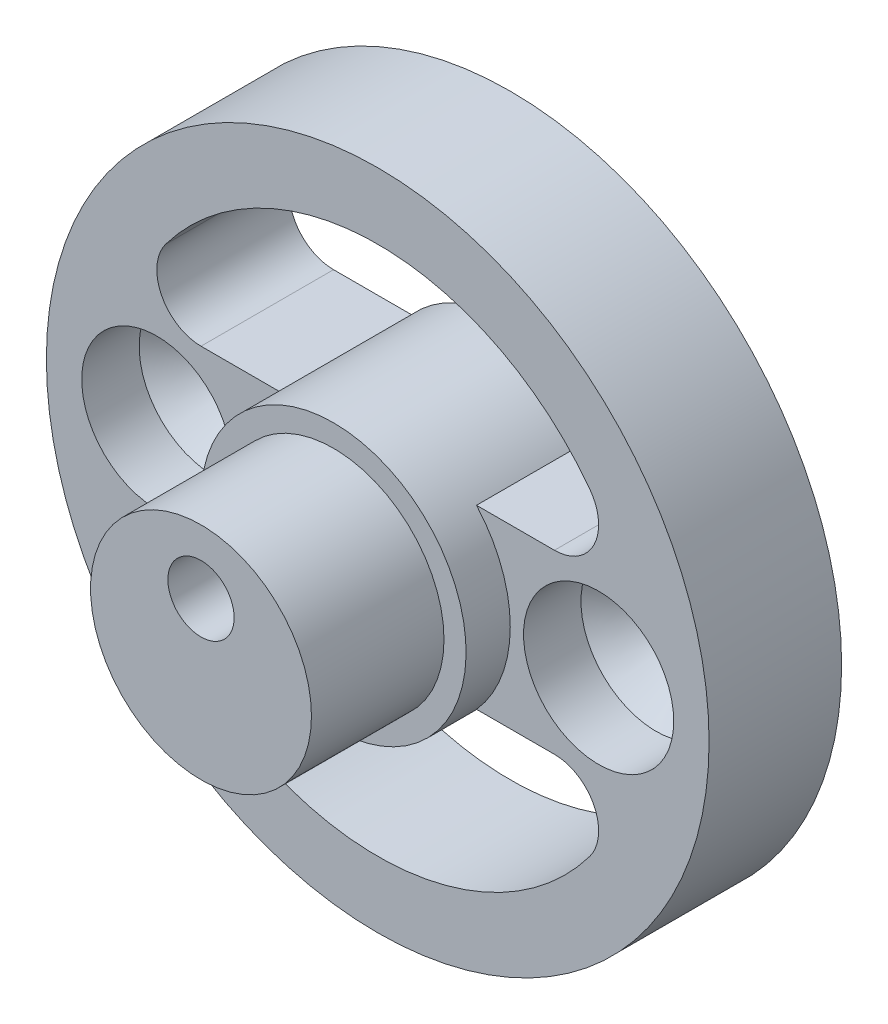
ISO-10303-21;
HEADER;
FILE_DESCRIPTION(('STEP AP214'),'2;1');
FILE_NAME('part.step','',(''),(''),'','','');
FILE_SCHEMA(('AUTOMOTIVE_DESIGN { 1 0 10303 214 1 1 1 1 }'));
ENDSEC;
DATA;
#1=APPLICATION_CONTEXT('core data for automotive mechanical design processes');
#2=APPLICATION_PROTOCOL_DEFINITION('international standard','automotive_design',2000,#1);
#3=PRODUCT_CONTEXT('',#1,'mechanical');
#4=PRODUCT('Part','Part','',(#3));
#5=PRODUCT_RELATED_PRODUCT_CATEGORY('part','',(#4));
#6=PRODUCT_DEFINITION_FORMATION('','',#4);
#7=PRODUCT_DEFINITION_CONTEXT('part definition',#1,'design');
#8=PRODUCT_DEFINITION('design','',#6,#7);
#9=PRODUCT_DEFINITION_SHAPE('','',#8);
#10=(LENGTH_UNIT() NAMED_UNIT(*) SI_UNIT(.MILLI.,.METRE.));
#11=(NAMED_UNIT(*) PLANE_ANGLE_UNIT() SI_UNIT($,.RADIAN.));
#12=(NAMED_UNIT(*) SI_UNIT($,.STERADIAN.) SOLID_ANGLE_UNIT());
#13=UNCERTAINTY_MEASURE_WITH_UNIT(LENGTH_MEASURE(1.E-05),#10,'distance_accuracy_value','');
#14=(GEOMETRIC_REPRESENTATION_CONTEXT(3) GLOBAL_UNCERTAINTY_ASSIGNED_CONTEXT((#13)) GLOBAL_UNIT_ASSIGNED_CONTEXT((#10,
#11,#12)) REPRESENTATION_CONTEXT('',''));
#15=CARTESIAN_POINT('',(0.,0.,0.));
#16=DIRECTION('',(0.,0.,1.));
#17=DIRECTION('',(1.,0.,0.));
#18=AXIS2_PLACEMENT_3D('',#15,#16,#17);
#19=CARTESIAN_POINT('',(5.,0.,-4.));
#20=DIRECTION('',(0.,0.,1.));
#21=DIRECTION('',(1.,0.,0.));
#22=AXIS2_PLACEMENT_3D('',#19,#20,#21);
#23=CYLINDRICAL_SURFACE('',#22,1.);
#24=CARTESIAN_POINT('',(5.,0.,-4.));
#25=DIRECTION('',(0.,0.,-1.));
#26=DIRECTION('',(-1.,0.,0.));
#27=AXIS2_PLACEMENT_3D('',#24,#25,#26);
#28=CIRCLE('',#27,1.);
#29=CARTESIAN_POINT('',(4.,0.,-4.));
#30=VERTEX_POINT('',#29);
#31=EDGE_CURVE('E179',#30,#30,#28,.T.);
#32=ORIENTED_EDGE('',*,*,#31,.T.);
#33=EDGE_LOOP('',(#32));
#34=FACE_BOUND('',#33,.T.);
#35=CARTESIAN_POINT('',(5.,0.,-3.));
#36=DIRECTION('',(0.,0.,1.));
#37=DIRECTION('',(1.,0.,0.));
#38=AXIS2_PLACEMENT_3D('',#35,#36,#37);
#39=CIRCLE('',#38,0.999999999999999);
#40=CARTESIAN_POINT('',(6.,0.,-3.));
#41=VERTEX_POINT('',#40);
#42=EDGE_CURVE('E267',#41,#41,#39,.F.);
#43=ORIENTED_EDGE('',*,*,#42,.F.);
#44=EDGE_LOOP('',(#43));
#45=FACE_BOUND('',#44,.T.);
#46=ADVANCED_FACE('F43',(#34,#45),#23,.F.);
#47=CARTESIAN_POINT('',(-5.,0.,-4.));
#48=DIRECTION('',(0.,0.,1.));
#49=DIRECTION('',(1.,0.,0.));
#50=AXIS2_PLACEMENT_3D('',#47,#48,#49);
#51=CYLINDRICAL_SURFACE('',#50,1.);
#52=CARTESIAN_POINT('',(-5.,0.,-4.));
#53=DIRECTION('',(0.,0.,-1.));
#54=DIRECTION('',(-1.,0.,0.));
#55=AXIS2_PLACEMENT_3D('',#52,#53,#54);
#56=CIRCLE('',#55,1.);
#57=CARTESIAN_POINT('',(-6.,0.,-4.));
#58=VERTEX_POINT('',#57);
#59=EDGE_CURVE('E160',#58,#58,#56,.T.);
#60=ORIENTED_EDGE('',*,*,#59,.T.);
#61=EDGE_LOOP('',(#60));
#62=FACE_BOUND('',#61,.T.);
#63=CARTESIAN_POINT('',(-5.,0.,-3.));
#64=DIRECTION('',(0.,0.,1.));
#65=DIRECTION('',(1.,0.,0.));
#66=AXIS2_PLACEMENT_3D('',#63,#64,#65);
#67=CIRCLE('',#66,0.999999999999997);
#68=CARTESIAN_POINT('',(-4.,0.,-3.));
#69=VERTEX_POINT('',#68);
#70=EDGE_CURVE('E262',#69,#69,#67,.F.);
#71=ORIENTED_EDGE('',*,*,#70,.F.);
#72=EDGE_LOOP('',(#71));
#73=FACE_BOUND('',#72,.T.);
#74=ADVANCED_FACE('F291',(#62,#73),#51,.F.);
#75=CARTESIAN_POINT('',(0.,0.,3.));
#76=DIRECTION('',(0.,0.,1.));
#77=DIRECTION('',(1.,0.,0.));
#78=AXIS2_PLACEMENT_3D('',#75,#76,#77);
#79=PLANE('',#78);
#80=CARTESIAN_POINT('',(0.,1.051,3.));
#81=DIRECTION('',(0.,0.,1.));
#82=DIRECTION('',(1.,0.,0.));
#83=AXIS2_PLACEMENT_3D('',#80,#81,#82);
#84=CIRCLE('',#83,0.75);
#85=CARTESIAN_POINT('',(0.75,1.051,3.));
#86=VERTEX_POINT('',#85);
#87=EDGE_CURVE('E216',#86,#86,#84,.T.);
#88=ORIENTED_EDGE('',*,*,#87,.F.);
#89=EDGE_LOOP('',(#88));
#90=FACE_BOUND('',#89,.T.);
#91=CARTESIAN_POINT('',(0.,0.,3.));
#92=DIRECTION('',(0.,0.,1.));
#93=DIRECTION('',(1.,0.,0.));
#94=AXIS2_PLACEMENT_3D('',#91,#92,#93);
#95=CIRCLE('',#94,2.5);
#96=CARTESIAN_POINT('',(2.5,0.,3.));
#97=VERTEX_POINT('',#96);
#98=EDGE_CURVE('E214',#97,#97,#95,.T.);
#99=ORIENTED_EDGE('',*,*,#98,.T.);
#100=EDGE_LOOP('',(#99));
#101=FACE_BOUND('',#100,.T.);
#102=ADVANCED_FACE('F294',(#90,#101),#79,.T.);
#103=CARTESIAN_POINT('',(0.,1.051,3.));
#104=DIRECTION('',(0.,0.,-1.));
#105=DIRECTION('',(-1.,0.,0.));
#106=AXIS2_PLACEMENT_3D('',#103,#104,#105);
#107=CYLINDRICAL_SURFACE('',#106,0.75);
#108=ORIENTED_EDGE('',*,*,#87,.T.);
#109=EDGE_LOOP('',(#108));
#110=FACE_BOUND('',#109,.T.);
#111=CARTESIAN_POINT('',(0.,1.051,-4.));
#112=DIRECTION('',(0.,0.,-1.));
#113=DIRECTION('',(-1.,0.,0.));
#114=AXIS2_PLACEMENT_3D('',#111,#112,#113);
#115=CIRCLE('',#114,0.75);
#116=CARTESIAN_POINT('',(-0.75,1.051,-4.));
#117=VERTEX_POINT('',#116);
#118=EDGE_CURVE('E173',#117,#117,#115,.T.);
#119=ORIENTED_EDGE('',*,*,#118,.T.);
#120=EDGE_LOOP('',(#119));
#121=FACE_BOUND('',#120,.T.);
#122=ADVANCED_FACE('F279',(#110,#121),#107,.F.);
#123=CARTESIAN_POINT('',(0.,0.,-7.));
#124=DIRECTION('',(0.,0.,1.));
#125=DIRECTION('',(1.,0.,0.));
#126=AXIS2_PLACEMENT_3D('',#123,#124,#125);
#127=CYLINDRICAL_SURFACE('',#126,2.5);
#128=ORIENTED_EDGE('',*,*,#98,.F.);
#129=EDGE_LOOP('',(#128));
#130=FACE_BOUND('',#129,.T.);
#131=CARTESIAN_POINT('',(0.,0.,0.));
#132=DIRECTION('',(0.,0.,1.));
#133=DIRECTION('',(1.,0.,0.));
#134=AXIS2_PLACEMENT_3D('',#131,#132,#133);
#135=CIRCLE('',#134,2.5);
#136=CARTESIAN_POINT('',(2.5,0.,0.));
#137=VERTEX_POINT('',#136);
#138=EDGE_CURVE('E220',#137,#137,#135,.T.);
#139=ORIENTED_EDGE('',*,*,#138,.T.);
#140=EDGE_LOOP('',(#139));
#141=FACE_BOUND('',#140,.T.);
#142=ADVANCED_FACE('F321',(#130,#141),#127,.T.);
#143=CARTESIAN_POINT('',(0.,0.,0.));
#144=DIRECTION('',(0.,0.,-1.));
#145=DIRECTION('',(-1.,0.,0.));
#146=AXIS2_PLACEMENT_3D('',#143,#144,#145);
#147=PLANE('',#146);
#148=ORIENTED_EDGE('',*,*,#138,.F.);
#149=EDGE_LOOP('',(#148));
#150=FACE_BOUND('',#149,.T.);
#151=CARTESIAN_POINT('',(0.,0.,0.));
#152=DIRECTION('',(0.,0.,-1.));
#153=DIRECTION('',(-1.,0.,0.));
#154=AXIS2_PLACEMENT_3D('',#151,#152,#153);
#155=CIRCLE('',#154,3.);
#156=CARTESIAN_POINT('',(-3.,0.,0.));
#157=VERTEX_POINT('',#156);
#158=EDGE_CURVE('E210',#157,#157,#155,.T.);
#159=ORIENTED_EDGE('',*,*,#158,.F.);
#160=EDGE_LOOP('',(#159));
#161=FACE_BOUND('',#160,.T.);
#162=ADVANCED_FACE('F322',(#150,#161),#147,.F.);
#163=CARTESIAN_POINT('',(0.,0.,-1.));
#164=DIRECTION('',(0.,0.,1.));
#165=DIRECTION('',(1.,0.,0.));
#166=AXIS2_PLACEMENT_3D('',#163,#164,#165);
#167=CYLINDRICAL_SURFACE('',#166,3.);
#168=CARTESIAN_POINT('',(0.,0.,-1.));
#169=DIRECTION('',(0.,0.,-1.));
#170=DIRECTION('',(-1.,0.,0.));
#171=AXIS2_PLACEMENT_3D('',#168,#169,#170);
#172=CIRCLE('',#171,3.);
#173=CARTESIAN_POINT('',(2.23606797749979,2.,-1.));
#174=VERTEX_POINT('',#173);
#175=CARTESIAN_POINT('',(2.23606797749979,-2.,-1.));
#176=VERTEX_POINT('',#175);
#177=EDGE_CURVE('E208',#174,#176,#172,.T.);
#178=ORIENTED_EDGE('',*,*,#177,.F.);
#179=DIRECTION('',(0.,0.,1.));
#180=VECTOR('',#179,1.);
#181=CARTESIAN_POINT('',(2.23606797749979,2.,-4.));
#182=LINE('',#181,#180);
#183=CARTESIAN_POINT('',(2.23606797749979,2.,-4.));
#184=VERTEX_POINT('',#183);
#185=EDGE_CURVE('E145',#184,#174,#182,.T.);
#186=ORIENTED_EDGE('',*,*,#185,.F.);
#187=CARTESIAN_POINT('',(0.,0.,-4.));
#188=DIRECTION('',(0.,0.,1.));
#189=DIRECTION('',(-1.,0.,0.));
#190=AXIS2_PLACEMENT_3D('',#187,#188,#189);
#191=CIRCLE('',#190,3.);
#192=CARTESIAN_POINT('',(-2.23606797749979,2.,-4.));
#193=VERTEX_POINT('',#192);
#194=EDGE_CURVE('E132',#184,#193,#191,.T.);
#195=ORIENTED_EDGE('',*,*,#194,.T.);
#196=DIRECTION('',(0.,0.,1.));
#197=VECTOR('',#196,1.);
#198=CARTESIAN_POINT('',(-2.23606797749979,2.,-4.));
#199=LINE('',#198,#197);
#200=CARTESIAN_POINT('',(-2.23606797749979,2.,-1.));
#201=VERTEX_POINT('',#200);
#202=EDGE_CURVE('E138',#193,#201,#199,.T.);
#203=ORIENTED_EDGE('',*,*,#202,.T.);
#204=CARTESIAN_POINT('',(-2.23606797749979,-2.,-1.));
#205=VERTEX_POINT('',#204);
#206=EDGE_CURVE('E206',#205,#201,#172,.T.);
#207=ORIENTED_EDGE('',*,*,#206,.F.);
#208=DIRECTION('',(0.,0.,1.));
#209=VECTOR('',#208,1.);
#210=CARTESIAN_POINT('',(-2.23606797749979,-2.,-4.));
#211=LINE('',#210,#209);
#212=CARTESIAN_POINT('',(-2.23606797749979,-2.,-4.));
#213=VERTEX_POINT('',#212);
#214=EDGE_CURVE('E201',#213,#205,#211,.T.);
#215=ORIENTED_EDGE('',*,*,#214,.F.);
#216=CARTESIAN_POINT('',(0.,0.,-4.));
#217=DIRECTION('',(0.,0.,1.));
#218=DIRECTION('',(-1.,0.,0.));
#219=AXIS2_PLACEMENT_3D('',#216,#217,#218);
#220=CIRCLE('',#219,3.);
#221=CARTESIAN_POINT('',(2.23606797749979,-2.,-4.));
#222=VERTEX_POINT('',#221);
#223=EDGE_CURVE('E188',#213,#222,#220,.T.);
#224=ORIENTED_EDGE('',*,*,#223,.T.);
#225=DIRECTION('',(0.,0.,1.));
#226=VECTOR('',#225,1.);
#227=CARTESIAN_POINT('',(2.23606797749979,-2.,-4.));
#228=LINE('',#227,#226);
#229=EDGE_CURVE('E196',#222,#176,#228,.T.);
#230=ORIENTED_EDGE('',*,*,#229,.T.);
#231=EDGE_LOOP('',(#178,#186,#195,#203,#207,#215,#224,#230));
#232=FACE_BOUND('',#231,.T.);
#233=ORIENTED_EDGE('',*,*,#158,.T.);
#234=EDGE_LOOP('',(#233));
#235=FACE_BOUND('',#234,.T.);
#236=ADVANCED_FACE('F140',(#232,#235),#167,.T.);
#237=CARTESIAN_POINT('',(0.,0.,-1.));
#238=DIRECTION('',(0.,0.,-1.));
#239=DIRECTION('',(-1.,0.,0.));
#240=AXIS2_PLACEMENT_3D('',#237,#238,#239);
#241=PLANE('',#240);
#242=CARTESIAN_POINT('',(-5.,0.,-1.));
#243=DIRECTION('',(0.,0.,1.));
#244=DIRECTION('',(1.,0.,0.));
#245=AXIS2_PLACEMENT_3D('',#242,#243,#244);
#246=CIRCLE('',#245,1.7);
#247=CARTESIAN_POINT('',(-3.3,0.,-1.));
#248=VERTEX_POINT('',#247);
#249=EDGE_CURVE('E270',#248,#248,#246,.T.);
#250=ORIENTED_EDGE('',*,*,#249,.F.);
#251=EDGE_LOOP('',(#250));
#252=FACE_BOUND('',#251,.T.);
#253=CARTESIAN_POINT('',(5.,0.,-1.));
#254=DIRECTION('',(0.,0.,1.));
#255=DIRECTION('',(1.,0.,0.));
#256=AXIS2_PLACEMENT_3D('',#253,#254,#255);
#257=CIRCLE('',#256,1.7);
#258=CARTESIAN_POINT('',(6.7,0.,-1.));
#259=VERTEX_POINT('',#258);
#260=EDGE_CURVE('E275',#259,#259,#257,.T.);
#261=ORIENTED_EDGE('',*,*,#260,.F.);
#262=EDGE_LOOP('',(#261));
#263=FACE_BOUND('',#262,.T.);
#264=CARTESIAN_POINT('',(0.,0.,-1.));
#265=DIRECTION('',(0.,0.,1.));
#266=DIRECTION('',(1.,0.,0.));
#267=AXIS2_PLACEMENT_3D('',#264,#265,#266);
#268=CIRCLE('',#267,7.5);
#269=CARTESIAN_POINT('',(7.5,0.,-1.));
#270=VERTEX_POINT('',#269);
#271=EDGE_CURVE('E398',#270,#270,#268,.T.);
#272=ORIENTED_EDGE('',*,*,#271,.T.);
#273=EDGE_LOOP('',(#272));
#274=FACE_BOUND('',#273,.T.);
#275=CARTESIAN_POINT('',(0.,0.,-1.));
#276=DIRECTION('',(0.,0.,-1.));
#277=DIRECTION('',(-1.,0.,0.));
#278=AXIS2_PLACEMENT_3D('',#275,#276,#277);
#279=CIRCLE('',#278,6.);
#280=CARTESIAN_POINT('',(-4.8,3.6,-1.));
#281=VERTEX_POINT('',#280);
#282=CARTESIAN_POINT('',(4.8,3.6,-1.));
#283=VERTEX_POINT('',#282);
#284=EDGE_CURVE('E175',#281,#283,#279,.T.);
#285=ORIENTED_EDGE('',*,*,#284,.T.);
#286=CARTESIAN_POINT('',(4.,3.,-1.));
#287=DIRECTION('',(0.,0.,-1.));
#288=DIRECTION('',(-1.,0.,0.));
#289=AXIS2_PLACEMENT_3D('',#286,#287,#288);
#290=CIRCLE('',#289,1.);
#291=CARTESIAN_POINT('',(4.,2.,-1.));
#292=VERTEX_POINT('',#291);
#293=EDGE_CURVE('E242',#283,#292,#290,.T.);
#294=ORIENTED_EDGE('',*,*,#293,.T.);
#295=DIRECTION('',(-1.,0.,0.));
#296=VECTOR('',#295,1.);
#297=CARTESIAN_POINT('',(2.23606797749979,2.,-1.));
#298=LINE('',#297,#296);
#299=EDGE_CURVE('E150',#292,#174,#298,.T.);
#300=ORIENTED_EDGE('',*,*,#299,.T.);
#301=ORIENTED_EDGE('',*,*,#177,.T.);
#302=DIRECTION('',(1.,0.,0.));
#303=VECTOR('',#302,1.);
#304=CARTESIAN_POINT('',(2.23606797749979,-2.,-1.));
#305=LINE('',#304,#303);
#306=CARTESIAN_POINT('',(4.,-2.,-1.));
#307=VERTEX_POINT('',#306);
#308=EDGE_CURVE('E189',#176,#307,#305,.T.);
#309=ORIENTED_EDGE('',*,*,#308,.T.);
#310=CARTESIAN_POINT('',(4.,-3.,-1.));
#311=DIRECTION('',(0.,0.,-1.));
#312=DIRECTION('',(-1.,0.,0.));
#313=AXIS2_PLACEMENT_3D('',#310,#311,#312);
#314=CIRCLE('',#313,1.);
#315=CARTESIAN_POINT('',(4.8,-3.6,-1.));
#316=VERTEX_POINT('',#315);
#317=EDGE_CURVE('E239',#307,#316,#314,.T.);
#318=ORIENTED_EDGE('',*,*,#317,.T.);
#319=CARTESIAN_POINT('',(0.,0.,-1.));
#320=DIRECTION('',(0.,0.,-1.));
#321=DIRECTION('',(-1.,0.,0.));
#322=AXIS2_PLACEMENT_3D('',#319,#320,#321);
#323=CIRCLE('',#322,6.);
#324=CARTESIAN_POINT('',(-4.8,-3.6,-1.));
#325=VERTEX_POINT('',#324);
#326=EDGE_CURVE('E182',#316,#325,#323,.T.);
#327=ORIENTED_EDGE('',*,*,#326,.T.);
#328=CARTESIAN_POINT('',(-4.,-3.,-1.));
#329=DIRECTION('',(0.,0.,-1.));
#330=DIRECTION('',(-1.,0.,0.));
#331=AXIS2_PLACEMENT_3D('',#328,#329,#330);
#332=CIRCLE('',#331,1.);
#333=CARTESIAN_POINT('',(-4.,-2.,-1.));
#334=VERTEX_POINT('',#333);
#335=EDGE_CURVE('E70',#325,#334,#332,.T.);
#336=ORIENTED_EDGE('',*,*,#335,.T.);
#337=DIRECTION('',(1.,0.,0.));
#338=VECTOR('',#337,1.);
#339=CARTESIAN_POINT('',(-2.23606797749979,-2.,-1.));
#340=LINE('',#339,#338);
#341=EDGE_CURVE('E198',#334,#205,#340,.T.);
#342=ORIENTED_EDGE('',*,*,#341,.T.);
#343=ORIENTED_EDGE('',*,*,#206,.T.);
#344=DIRECTION('',(-1.,0.,0.));
#345=VECTOR('',#344,1.);
#346=CARTESIAN_POINT('',(-2.23606797749979,2.,-1.));
#347=LINE('',#346,#345);
#348=CARTESIAN_POINT('',(-4.,2.,-1.));
#349=VERTEX_POINT('',#348);
#350=EDGE_CURVE('E157',#201,#349,#347,.T.);
#351=ORIENTED_EDGE('',*,*,#350,.T.);
#352=CARTESIAN_POINT('',(-4.,3.,-1.));
#353=DIRECTION('',(0.,0.,-1.));
#354=DIRECTION('',(-1.,0.,0.));
#355=AXIS2_PLACEMENT_3D('',#352,#353,#354);
#356=CIRCLE('',#355,1.);
#357=EDGE_CURVE('E247',#349,#281,#356,.T.);
#358=ORIENTED_EDGE('',*,*,#357,.T.);
#359=EDGE_LOOP('',(#285,#294,#300,#301,#309,#318,#327,#336,#342,#343,#351,#358));
#360=FACE_BOUND('',#359,.T.);
#361=ADVANCED_FACE('F283',(#252,#263,#274,#360),#241,.F.);
#362=CARTESIAN_POINT('',(0.,0.,-4.));
#363=DIRECTION('',(0.,0.,-1.));
#364=DIRECTION('',(-1.,0.,0.));
#365=AXIS2_PLACEMENT_3D('',#362,#363,#364);
#366=PLANE('',#365);
#367=CARTESIAN_POINT('',(0.,0.,-4.));
#368=DIRECTION('',(0.,0.,1.));
#369=DIRECTION('',(1.,0.,0.));
#370=AXIS2_PLACEMENT_3D('',#367,#368,#369);
#371=CIRCLE('',#370,7.5);
#372=CARTESIAN_POINT('',(7.5,0.,-4.));
#373=VERTEX_POINT('',#372);
#374=EDGE_CURVE('E400',#373,#373,#371,.T.);
#375=ORIENTED_EDGE('',*,*,#374,.F.);
#376=EDGE_LOOP('',(#375));
#377=FACE_BOUND('',#376,.T.);
#378=ORIENTED_EDGE('',*,*,#118,.F.);
#379=EDGE_LOOP('',(#378));
#380=FACE_BOUND('',#379,.T.);
#381=ORIENTED_EDGE('',*,*,#31,.F.);
#382=EDGE_LOOP('',(#381));
#383=FACE_BOUND('',#382,.T.);
#384=DIRECTION('',(1.,0.,0.));
#385=VECTOR('',#384,1.);
#386=CARTESIAN_POINT('',(-2.23606797749979,-2.,-4.));
#387=LINE('',#386,#385);
#388=CARTESIAN_POINT('',(-4.,-2.,-4.));
#389=VERTEX_POINT('',#388);
#390=EDGE_CURVE('E190',#389,#213,#387,.T.);
#391=ORIENTED_EDGE('',*,*,#390,.F.);
#392=CARTESIAN_POINT('',(-4.,-3.,-4.));
#393=DIRECTION('',(0.,0.,-1.));
#394=DIRECTION('',(-1.,0.,0.));
#395=AXIS2_PLACEMENT_3D('',#392,#393,#394);
#396=CIRCLE('',#395,1.);
#397=CARTESIAN_POINT('',(-4.8,-3.6,-4.));
#398=VERTEX_POINT('',#397);
#399=EDGE_CURVE('E255',#389,#398,#396,.F.);
#400=ORIENTED_EDGE('',*,*,#399,.T.);
#401=CARTESIAN_POINT('',(0.,0.,-4.));
#402=DIRECTION('',(0.,0.,-1.));
#403=DIRECTION('',(-1.,0.,0.));
#404=AXIS2_PLACEMENT_3D('',#401,#402,#403);
#405=CIRCLE('',#404,6.);
#406=CARTESIAN_POINT('',(4.8,-3.6,-4.));
#407=VERTEX_POINT('',#406);
#408=EDGE_CURVE('E183',#407,#398,#405,.T.);
#409=ORIENTED_EDGE('',*,*,#408,.F.);
#410=CARTESIAN_POINT('',(4.,-3.,-4.));
#411=DIRECTION('',(0.,0.,-1.));
#412=DIRECTION('',(-1.,0.,0.));
#413=AXIS2_PLACEMENT_3D('',#410,#411,#412);
#414=CIRCLE('',#413,1.);
#415=CARTESIAN_POINT('',(4.,-2.,-4.));
#416=VERTEX_POINT('',#415);
#417=EDGE_CURVE('E245',#407,#416,#414,.F.);
#418=ORIENTED_EDGE('',*,*,#417,.T.);
#419=DIRECTION('',(1.,0.,0.));
#420=VECTOR('',#419,1.);
#421=CARTESIAN_POINT('',(2.23606797749979,-2.,-4.));
#422=LINE('',#421,#420);
#423=EDGE_CURVE('E194',#222,#416,#422,.T.);
#424=ORIENTED_EDGE('',*,*,#423,.F.);
#425=ORIENTED_EDGE('',*,*,#223,.F.);
#426=EDGE_LOOP('',(#391,#400,#409,#418,#424,#425));
#427=FACE_BOUND('',#426,.T.);
#428=ORIENTED_EDGE('',*,*,#59,.F.);
#429=EDGE_LOOP('',(#428));
#430=FACE_BOUND('',#429,.T.);
#431=DIRECTION('',(-1.,0.,0.));
#432=VECTOR('',#431,1.);
#433=CARTESIAN_POINT('',(-2.23606797749979,2.,-4.));
#434=LINE('',#433,#432);
#435=CARTESIAN_POINT('',(-4.,2.,-4.));
#436=VERTEX_POINT('',#435);
#437=EDGE_CURVE('E147',#193,#436,#434,.T.);
#438=ORIENTED_EDGE('',*,*,#437,.F.);
#439=ORIENTED_EDGE('',*,*,#194,.F.);
#440=DIRECTION('',(-1.,0.,0.));
#441=VECTOR('',#440,1.);
#442=CARTESIAN_POINT('',(2.23606797749979,2.,-4.));
#443=LINE('',#442,#441);
#444=CARTESIAN_POINT('',(4.,2.,-4.));
#445=VERTEX_POINT('',#444);
#446=EDGE_CURVE('E168',#445,#184,#443,.T.);
#447=ORIENTED_EDGE('',*,*,#446,.F.);
#448=CARTESIAN_POINT('',(4.,3.,-4.));
#449=DIRECTION('',(0.,0.,-1.));
#450=DIRECTION('',(-1.,0.,0.));
#451=AXIS2_PLACEMENT_3D('',#448,#449,#450);
#452=CIRCLE('',#451,1.);
#453=CARTESIAN_POINT('',(4.8,3.6,-4.));
#454=VERTEX_POINT('',#453);
#455=EDGE_CURVE('E246',#445,#454,#452,.F.);
#456=ORIENTED_EDGE('',*,*,#455,.T.);
#457=CARTESIAN_POINT('',(0.,0.,-4.));
#458=DIRECTION('',(0.,0.,-1.));
#459=DIRECTION('',(-1.,0.,0.));
#460=AXIS2_PLACEMENT_3D('',#457,#458,#459);
#461=CIRCLE('',#460,6.);
#462=CARTESIAN_POINT('',(-4.8,3.6,-4.));
#463=VERTEX_POINT('',#462);
#464=EDGE_CURVE('E161',#463,#454,#461,.T.);
#465=ORIENTED_EDGE('',*,*,#464,.F.);
#466=CARTESIAN_POINT('',(-4.,3.,-4.));
#467=DIRECTION('',(0.,0.,-1.));
#468=DIRECTION('',(-1.,0.,0.));
#469=AXIS2_PLACEMENT_3D('',#466,#467,#468);
#470=CIRCLE('',#469,1.);
#471=EDGE_CURVE('E162',#463,#436,#470,.F.);
#472=ORIENTED_EDGE('',*,*,#471,.T.);
#473=EDGE_LOOP('',(#438,#439,#447,#456,#465,#472));
#474=FACE_BOUND('',#473,.T.);
#475=ADVANCED_FACE('F156',(#377,#380,#383,#427,#430,#474),#366,.T.);
#476=CARTESIAN_POINT('',(0.,0.,-4.));
#477=DIRECTION('',(0.,0.,1.));
#478=DIRECTION('',(1.,0.,0.));
#479=AXIS2_PLACEMENT_3D('',#476,#477,#478);
#480=CYLINDRICAL_SURFACE('',#479,6.);
#481=ORIENTED_EDGE('',*,*,#326,.F.);
#482=DIRECTION('',(0.,0.,1.));
#483=VECTOR('',#482,1.);
#484=CARTESIAN_POINT('',(4.8,-3.6,-4.));
#485=LINE('',#484,#483);
#486=EDGE_CURVE('E226',#316,#407,#485,.F.);
#487=ORIENTED_EDGE('',*,*,#486,.T.);
#488=ORIENTED_EDGE('',*,*,#408,.T.);
#489=DIRECTION('',(0.,0.,1.));
#490=VECTOR('',#489,1.);
#491=CARTESIAN_POINT('',(-4.8,-3.6,-4.));
#492=LINE('',#491,#490);
#493=EDGE_CURVE('E223',#398,#325,#492,.T.);
#494=ORIENTED_EDGE('',*,*,#493,.T.);
#495=EDGE_LOOP('',(#481,#487,#488,#494));
#496=FACE_BOUND('',#495,.T.);
#497=ADVANCED_FACE('F285',(#496),#480,.F.);
#498=CARTESIAN_POINT('',(-2.23606797749979,-2.,-4.));
#499=DIRECTION('',(0.,-1.,0.));
#500=DIRECTION('',(0.,0.,-1.));
#501=AXIS2_PLACEMENT_3D('',#498,#499,#500);
#502=PLANE('',#501);
#503=ORIENTED_EDGE('',*,*,#341,.F.);
#504=DIRECTION('',(0.,0.,-1.));
#505=VECTOR('',#504,1.);
#506=CARTESIAN_POINT('',(-4.,-2.,-4.));
#507=LINE('',#506,#505);
#508=EDGE_CURVE('E56',#334,#389,#507,.T.);
#509=ORIENTED_EDGE('',*,*,#508,.T.);
#510=ORIENTED_EDGE('',*,*,#390,.T.);
#511=ORIENTED_EDGE('',*,*,#214,.T.);
#512=EDGE_LOOP('',(#503,#509,#510,#511));
#513=FACE_BOUND('',#512,.T.);
#514=ADVANCED_FACE('F315',(#513),#502,.T.);
#515=CARTESIAN_POINT('',(2.23606797749979,-2.,-4.));
#516=DIRECTION('',(0.,-1.,0.));
#517=DIRECTION('',(1.,0.,0.));
#518=AXIS2_PLACEMENT_3D('',#515,#516,#517);
#519=PLANE('',#518);
#520=ORIENTED_EDGE('',*,*,#423,.T.);
#521=DIRECTION('',(0.,0.,-1.));
#522=VECTOR('',#521,1.);
#523=CARTESIAN_POINT('',(4.,-2.,-1.));
#524=LINE('',#523,#522);
#525=EDGE_CURVE('E219',#416,#307,#524,.F.);
#526=ORIENTED_EDGE('',*,*,#525,.T.);
#527=ORIENTED_EDGE('',*,*,#308,.F.);
#528=ORIENTED_EDGE('',*,*,#229,.F.);
#529=EDGE_LOOP('',(#520,#526,#527,#528));
#530=FACE_BOUND('',#529,.T.);
#531=ADVANCED_FACE('F307',(#530),#519,.T.);
#532=CARTESIAN_POINT('',(-2.23606797749979,2.,-4.));
#533=DIRECTION('',(0.,1.,0.));
#534=DIRECTION('',(0.,0.,1.));
#535=AXIS2_PLACEMENT_3D('',#532,#533,#534);
#536=PLANE('',#535);
#537=ORIENTED_EDGE('',*,*,#437,.T.);
#538=DIRECTION('',(0.,0.,-1.));
#539=VECTOR('',#538,1.);
#540=CARTESIAN_POINT('',(-4.,2.,-1.));
#541=LINE('',#540,#539);
#542=EDGE_CURVE('E240',#436,#349,#541,.F.);
#543=ORIENTED_EDGE('',*,*,#542,.T.);
#544=ORIENTED_EDGE('',*,*,#350,.F.);
#545=ORIENTED_EDGE('',*,*,#202,.F.);
#546=EDGE_LOOP('',(#537,#543,#544,#545));
#547=FACE_BOUND('',#546,.T.);
#548=ADVANCED_FACE('F155',(#547),#536,.T.);
#549=CARTESIAN_POINT('',(0.,0.,-4.));
#550=DIRECTION('',(0.,0.,1.));
#551=DIRECTION('',(1.,0.,0.));
#552=AXIS2_PLACEMENT_3D('',#549,#550,#551);
#553=CYLINDRICAL_SURFACE('',#552,6.);
#554=ORIENTED_EDGE('',*,*,#464,.T.);
#555=DIRECTION('',(0.,0.,1.));
#556=VECTOR('',#555,1.);
#557=CARTESIAN_POINT('',(4.8,3.6,-4.));
#558=LINE('',#557,#556);
#559=EDGE_CURVE('E235',#454,#283,#558,.T.);
#560=ORIENTED_EDGE('',*,*,#559,.T.);
#561=ORIENTED_EDGE('',*,*,#284,.F.);
#562=DIRECTION('',(0.,0.,1.));
#563=VECTOR('',#562,1.);
#564=CARTESIAN_POINT('',(-4.8,3.6,-4.));
#565=LINE('',#564,#563);
#566=EDGE_CURVE('E229',#281,#463,#565,.F.);
#567=ORIENTED_EDGE('',*,*,#566,.T.);
#568=EDGE_LOOP('',(#554,#560,#561,#567));
#569=FACE_BOUND('',#568,.T.);
#570=ADVANCED_FACE('F375',(#569),#553,.F.);
#571=CARTESIAN_POINT('',(2.23606797749979,2.,-4.));
#572=DIRECTION('',(0.,1.,0.));
#573=DIRECTION('',(-1.,0.,0.));
#574=AXIS2_PLACEMENT_3D('',#571,#572,#573);
#575=PLANE('',#574);
#576=ORIENTED_EDGE('',*,*,#299,.F.);
#577=DIRECTION('',(0.,0.,-1.));
#578=VECTOR('',#577,1.);
#579=CARTESIAN_POINT('',(4.,2.,-4.));
#580=LINE('',#579,#578);
#581=EDGE_CURVE('E232',#292,#445,#580,.T.);
#582=ORIENTED_EDGE('',*,*,#581,.T.);
#583=ORIENTED_EDGE('',*,*,#446,.T.);
#584=ORIENTED_EDGE('',*,*,#185,.T.);
#585=EDGE_LOOP('',(#576,#582,#583,#584));
#586=FACE_BOUND('',#585,.T.);
#587=ADVANCED_FACE('F336',(#586),#575,.T.);
#588=CARTESIAN_POINT('',(4.,-3.,-4.));
#589=DIRECTION('',(0.,0.,1.));
#590=DIRECTION('',(1.,0.,0.));
#591=AXIS2_PLACEMENT_3D('',#588,#589,#590);
#592=CYLINDRICAL_SURFACE('',#591,1.);
#593=ORIENTED_EDGE('',*,*,#417,.F.);
#594=ORIENTED_EDGE('',*,*,#486,.F.);
#595=ORIENTED_EDGE('',*,*,#317,.F.);
#596=ORIENTED_EDGE('',*,*,#525,.F.);
#597=EDGE_LOOP('',(#593,#594,#595,#596));
#598=FACE_BOUND('',#597,.T.);
#599=ADVANCED_FACE('F331',(#598),#592,.F.);
#600=CARTESIAN_POINT('',(4.,3.,-4.));
#601=DIRECTION('',(0.,0.,1.));
#602=DIRECTION('',(1.,0.,0.));
#603=AXIS2_PLACEMENT_3D('',#600,#601,#602);
#604=CYLINDRICAL_SURFACE('',#603,1.);
#605=ORIENTED_EDGE('',*,*,#455,.F.);
#606=ORIENTED_EDGE('',*,*,#581,.F.);
#607=ORIENTED_EDGE('',*,*,#293,.F.);
#608=ORIENTED_EDGE('',*,*,#559,.F.);
#609=EDGE_LOOP('',(#605,#606,#607,#608));
#610=FACE_BOUND('',#609,.T.);
#611=ADVANCED_FACE('F340',(#610),#604,.F.);
#612=CARTESIAN_POINT('',(-4.,3.,-4.));
#613=DIRECTION('',(0.,0.,1.));
#614=DIRECTION('',(1.,0.,0.));
#615=AXIS2_PLACEMENT_3D('',#612,#613,#614);
#616=CYLINDRICAL_SURFACE('',#615,1.);
#617=ORIENTED_EDGE('',*,*,#471,.F.);
#618=ORIENTED_EDGE('',*,*,#566,.F.);
#619=ORIENTED_EDGE('',*,*,#357,.F.);
#620=ORIENTED_EDGE('',*,*,#542,.F.);
#621=EDGE_LOOP('',(#617,#618,#619,#620));
#622=FACE_BOUND('',#621,.T.);
#623=ADVANCED_FACE('F345',(#622),#616,.F.);
#624=CARTESIAN_POINT('',(-4.,-3.,-4.));
#625=DIRECTION('',(0.,0.,1.));
#626=DIRECTION('',(1.,0.,0.));
#627=AXIS2_PLACEMENT_3D('',#624,#625,#626);
#628=CYLINDRICAL_SURFACE('',#627,1.);
#629=ORIENTED_EDGE('',*,*,#399,.F.);
#630=ORIENTED_EDGE('',*,*,#508,.F.);
#631=ORIENTED_EDGE('',*,*,#335,.F.);
#632=ORIENTED_EDGE('',*,*,#493,.F.);
#633=EDGE_LOOP('',(#629,#630,#631,#632));
#634=FACE_BOUND('',#633,.T.);
#635=ADVANCED_FACE('F346',(#634),#628,.F.);
#636=CARTESIAN_POINT('',(-5.,0.,-3.));
#637=DIRECTION('',(0.,0.,1.));
#638=DIRECTION('',(1.,0.,0.));
#639=AXIS2_PLACEMENT_3D('',#636,#637,#638);
#640=CYLINDRICAL_SURFACE('',#639,1.7);
#641=ORIENTED_EDGE('',*,*,#249,.T.);
#642=EDGE_LOOP('',(#641));
#643=FACE_BOUND('',#642,.T.);
#644=CARTESIAN_POINT('',(-5.,0.,-2.3));
#645=DIRECTION('',(0.,0.,1.));
#646=DIRECTION('',(1.,0.,0.));
#647=AXIS2_PLACEMENT_3D('',#644,#645,#646);
#648=CIRCLE('',#647,1.7);
#649=CARTESIAN_POINT('',(-3.3,0.,-2.3));
#650=VERTEX_POINT('',#649);
#651=EDGE_CURVE('E55',#650,#650,#648,.F.);
#652=ORIENTED_EDGE('',*,*,#651,.T.);
#653=EDGE_LOOP('',(#652));
#654=FACE_BOUND('',#653,.T.);
#655=ADVANCED_FACE('F257',(#643,#654),#640,.F.);
#656=CARTESIAN_POINT('',(5.,0.,-3.));
#657=DIRECTION('',(0.,0.,1.));
#658=DIRECTION('',(1.,0.,0.));
#659=AXIS2_PLACEMENT_3D('',#656,#657,#658);
#660=CYLINDRICAL_SURFACE('',#659,1.7);
#661=ORIENTED_EDGE('',*,*,#260,.T.);
#662=EDGE_LOOP('',(#661));
#663=FACE_BOUND('',#662,.T.);
#664=CARTESIAN_POINT('',(5.,0.,-2.3));
#665=DIRECTION('',(0.,0.,1.));
#666=DIRECTION('',(1.,0.,0.));
#667=AXIS2_PLACEMENT_3D('',#664,#665,#666);
#668=CIRCLE('',#667,1.7);
#669=CARTESIAN_POINT('',(6.7,0.,-2.3));
#670=VERTEX_POINT('',#669);
#671=EDGE_CURVE('E11',#670,#670,#668,.F.);
#672=ORIENTED_EDGE('',*,*,#671,.T.);
#673=EDGE_LOOP('',(#672));
#674=FACE_BOUND('',#673,.T.);
#675=ADVANCED_FACE('F261',(#663,#674),#660,.F.);
#676=CARTESIAN_POINT('',(-5.,0.,-3.));
#677=DIRECTION('',(0.,0.,1.));
#678=DIRECTION('',(1.,0.,0.));
#679=AXIS2_PLACEMENT_3D('',#676,#677,#678);
#680=CONICAL_SURFACE('',#679,0.999999999999992,0.785398163397454);
#681=ORIENTED_EDGE('',*,*,#651,.F.);
#682=EDGE_LOOP('',(#681));
#683=FACE_BOUND('',#682,.T.);
#684=ORIENTED_EDGE('',*,*,#70,.T.);
#685=EDGE_LOOP('',(#684));
#686=FACE_BOUND('',#685,.T.);
#687=ADVANCED_FACE('F259',(#683,#686),#680,.F.);
#688=CARTESIAN_POINT('',(5.,0.,-3.));
#689=DIRECTION('',(0.,0.,1.));
#690=DIRECTION('',(1.,0.,0.));
#691=AXIS2_PLACEMENT_3D('',#688,#689,#690);
#692=CONICAL_SURFACE('',#691,0.999999999999992,0.785398163397454);
#693=ORIENTED_EDGE('',*,*,#671,.F.);
#694=EDGE_LOOP('',(#693));
#695=FACE_BOUND('',#694,.T.);
#696=ORIENTED_EDGE('',*,*,#42,.T.);
#697=EDGE_LOOP('',(#696));
#698=FACE_BOUND('',#697,.T.);
#699=ADVANCED_FACE('F46',(#695,#698),#692,.F.);
#700=CARTESIAN_POINT('',(0.,0.,-4.));
#701=DIRECTION('',(0.,0.,1.));
#702=DIRECTION('',(1.,0.,0.));
#703=AXIS2_PLACEMENT_3D('',#700,#701,#702);
#704=CYLINDRICAL_SURFACE('',#703,7.5);
#705=ORIENTED_EDGE('',*,*,#374,.T.);
#706=EDGE_LOOP('',(#705));
#707=FACE_BOUND('',#706,.T.);
#708=ORIENTED_EDGE('',*,*,#271,.F.);
#709=EDGE_LOOP('',(#708));
#710=FACE_BOUND('',#709,.T.);
#711=ADVANCED_FACE('F390',(#707,#710),#704,.T.);
#712=CLOSED_SHELL('',(#46,#74,#102,#122,#142,#162,#236,#361,#475,#497,#514,#531,#548,#570,#587,
#599,#611,#623,#635,#655,#675,#687,#699,#711));
#713=MANIFOLD_SOLID_BREP('B2',#712);
#714=ADVANCED_BREP_SHAPE_REPRESENTATION('',(#18,#713),#14);
#715=SHAPE_DEFINITION_REPRESENTATION(#9,#714);
ENDSEC;
END-ISO-10303-21;
